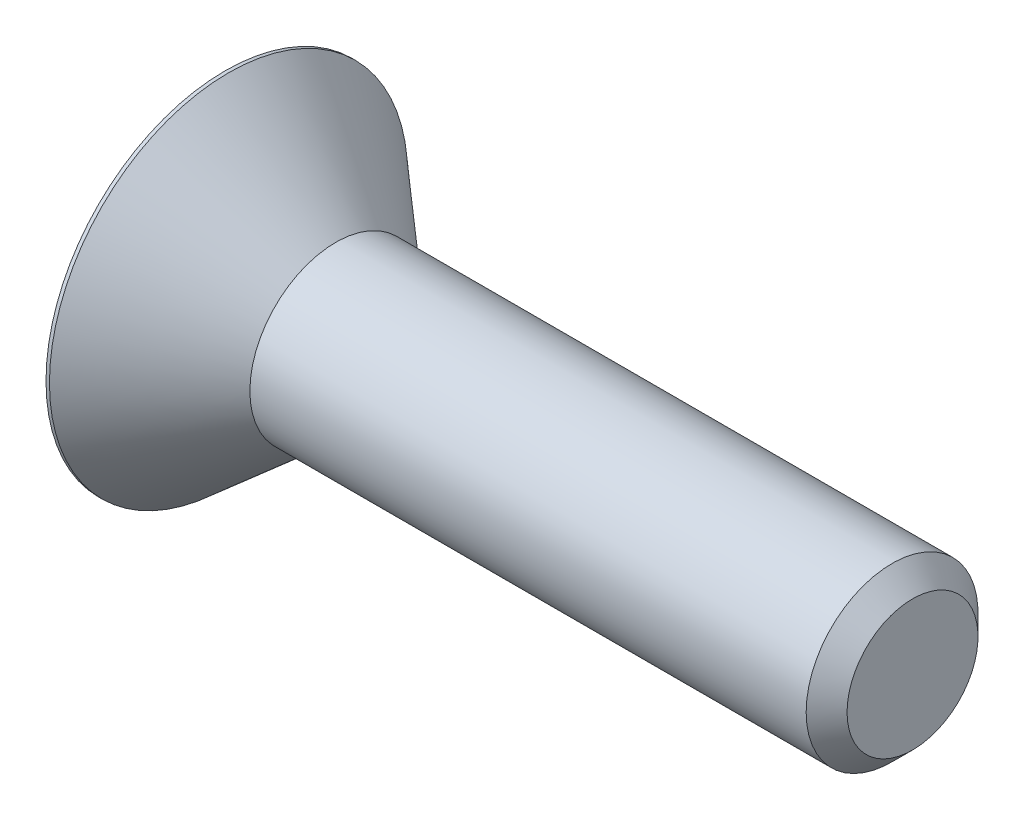
ISO-10303-21;
HEADER;
FILE_DESCRIPTION(('STEP AP214'),'2;1');
FILE_NAME('part.step','',(''),(''),'','','');
FILE_SCHEMA(('AUTOMOTIVE_DESIGN { 1 0 10303 214 1 1 1 1 }'));
ENDSEC;
DATA;
#1=APPLICATION_CONTEXT('core data for automotive mechanical design processes');
#2=APPLICATION_PROTOCOL_DEFINITION('international standard','automotive_design',2000,#1);
#3=PRODUCT_CONTEXT('',#1,'mechanical');
#4=PRODUCT('Part','Part','',(#3));
#5=PRODUCT_RELATED_PRODUCT_CATEGORY('part','',(#4));
#6=PRODUCT_DEFINITION_FORMATION('','',#4);
#7=PRODUCT_DEFINITION_CONTEXT('part definition',#1,'design');
#8=PRODUCT_DEFINITION('design','',#6,#7);
#9=PRODUCT_DEFINITION_SHAPE('','',#8);
#10=(LENGTH_UNIT() NAMED_UNIT(*) SI_UNIT(.MILLI.,.METRE.));
#11=(NAMED_UNIT(*) PLANE_ANGLE_UNIT() SI_UNIT($,.RADIAN.));
#12=(NAMED_UNIT(*) SI_UNIT($,.STERADIAN.) SOLID_ANGLE_UNIT());
#13=UNCERTAINTY_MEASURE_WITH_UNIT(LENGTH_MEASURE(1.E-05),#10,'distance_accuracy_value','');
#14=(GEOMETRIC_REPRESENTATION_CONTEXT(3) GLOBAL_UNCERTAINTY_ASSIGNED_CONTEXT((#13)) GLOBAL_UNIT_ASSIGNED_CONTEXT((#10,
#11,#12)) REPRESENTATION_CONTEXT('',''));
#15=CARTESIAN_POINT('',(0.,0.,0.));
#16=DIRECTION('',(0.,0.,1.));
#17=DIRECTION('',(1.,0.,0.));
#18=AXIS2_PLACEMENT_3D('',#15,#16,#17);
#19=CARTESIAN_POINT('',(0.,0.,0.));
#20=DIRECTION('',(-1.,0.,0.));
#21=DIRECTION('',(0.,0.,1.));
#22=AXIS2_PLACEMENT_3D('',#19,#20,#21);
#23=PLANE('',#22);
#24=CARTESIAN_POINT('',(0.,0.,0.));
#25=DIRECTION('',(-1.,0.,0.));
#26=DIRECTION('',(0.,0.,1.));
#27=AXIS2_PLACEMENT_3D('',#24,#25,#26);
#28=CIRCLE('',#27,6.61924);
#29=CARTESIAN_POINT('',(0.,0.,6.61924));
#30=VERTEX_POINT('',#29);
#31=EDGE_CURVE('E11',#30,#30,#28,.T.);
#32=ORIENTED_EDGE('',*,*,#31,.T.);
#33=EDGE_LOOP('',(#32));
#34=FACE_BOUND('',#33,.T.);
#35=DIRECTION('',(0.,-0.499999999999999,-0.866025403784439));
#36=VECTOR('',#35,1.);
#37=CARTESIAN_POINT('',(0.,-1.14384635331843,1.98120000000035));
#38=LINE('',#37,#36);
#39=CARTESIAN_POINT('',(0.,-1.14384635331843,1.98120000000035));
#40=VERTEX_POINT('',#39);
#41=CARTESIAN_POINT('',(0.,-2.28769270663687,0.));
#42=VERTEX_POINT('',#41);
#43=EDGE_CURVE('E124',#40,#42,#38,.T.);
#44=ORIENTED_EDGE('',*,*,#43,.T.);
#45=DIRECTION('',(0.,0.5,-0.866025403784439));
#46=VECTOR('',#45,1.);
#47=CARTESIAN_POINT('',(0.,-2.28769270663687,0.));
#48=LINE('',#47,#46);
#49=CARTESIAN_POINT('',(0.,-1.14384635331843,-1.98119999999991));
#50=VERTEX_POINT('',#49);
#51=EDGE_CURVE('E54',#42,#50,#48,.T.);
#52=ORIENTED_EDGE('',*,*,#51,.T.);
#53=DIRECTION('',(0.,1.,0.));
#54=VECTOR('',#53,1.);
#55=CARTESIAN_POINT('',(0.,-1.14384635331843,-1.98119999999991));
#56=LINE('',#55,#54);
#57=CARTESIAN_POINT('',(0.,1.14384635331843,-1.98119999999946));
#58=VERTEX_POINT('',#57);
#59=EDGE_CURVE('E139',#50,#58,#56,.T.);
#60=ORIENTED_EDGE('',*,*,#59,.T.);
#61=DIRECTION('',(0.,0.499999999999999,0.866025403784439));
#62=VECTOR('',#61,1.);
#63=CARTESIAN_POINT('',(0.,1.14384635331843,-1.98119999999946));
#64=LINE('',#63,#62);
#65=CARTESIAN_POINT('',(-1.38777878078145E-13,2.28769270663687,0.));
#66=VERTEX_POINT('',#65);
#67=EDGE_CURVE('E209',#58,#66,#64,.T.);
#68=ORIENTED_EDGE('',*,*,#67,.T.);
#69=DIRECTION('',(0.,-0.5,0.866025403784439));
#70=VECTOR('',#69,1.);
#71=CARTESIAN_POINT('',(-1.38777878078145E-13,2.28769270663687,0.));
#72=LINE('',#71,#70);
#73=CARTESIAN_POINT('',(0.,1.14384635331843,1.98120000000035));
#74=VERTEX_POINT('',#73);
#75=EDGE_CURVE('E193',#66,#74,#72,.T.);
#76=ORIENTED_EDGE('',*,*,#75,.T.);
#77=DIRECTION('',(0.,-1.,0.));
#78=VECTOR('',#77,1.);
#79=CARTESIAN_POINT('',(0.,1.14384635331843,1.98120000000035));
#80=LINE('',#79,#78);
#81=EDGE_CURVE('E188',#74,#40,#80,.T.);
#82=ORIENTED_EDGE('',*,*,#81,.T.);
#83=EDGE_LOOP('',(#44,#52,#60,#68,#76,#82));
#84=FACE_BOUND('',#83,.T.);
#85=ADVANCED_FACE('F40',(#34,#84),#23,.T.);
#86=CARTESIAN_POINT('',(0.,0.,0.));
#87=DIRECTION('',(-1.,0.,0.));
#88=DIRECTION('',(0.,0.,1.));
#89=AXIS2_PLACEMENT_3D('',#86,#87,#88);
#90=CYLINDRICAL_SURFACE('',#89,6.61924);
#91=CARTESIAN_POINT('',(0.126999999999999,0.,0.));
#92=DIRECTION('',(-1.,0.,0.));
#93=DIRECTION('',(0.,0.,1.));
#94=AXIS2_PLACEMENT_3D('',#91,#92,#93);
#95=CIRCLE('',#94,6.61924);
#96=CARTESIAN_POINT('',(0.126999999999999,0.,6.61924));
#97=VERTEX_POINT('',#96);
#98=EDGE_CURVE('E47',#97,#97,#95,.T.);
#99=ORIENTED_EDGE('',*,*,#98,.T.);
#100=EDGE_LOOP('',(#99));
#101=FACE_BOUND('',#100,.T.);
#102=ORIENTED_EDGE('',*,*,#31,.F.);
#103=EDGE_LOOP('',(#102));
#104=FACE_BOUND('',#103,.T.);
#105=ADVANCED_FACE('F164',(#101,#104),#90,.T.);
#106=CARTESIAN_POINT('',(0.126999999999999,0.,0.));
#107=DIRECTION('',(-1.,0.,0.));
#108=DIRECTION('',(0.,0.,1.));
#109=AXIS2_PLACEMENT_3D('',#106,#107,#108);
#110=CONICAL_SURFACE('',#109,6.61924,0.715584993317678);
#111=CARTESIAN_POINT('',(4.08914488288686,0.,0.));
#112=DIRECTION('',(-1.,0.,0.));
#113=DIRECTION('',(0.,0.,1.));
#114=AXIS2_PLACEMENT_3D('',#111,#112,#113);
#115=CIRCLE('',#114,3.175);
#116=CARTESIAN_POINT('',(4.08914488288686,0.,3.175));
#117=VERTEX_POINT('',#116);
#118=EDGE_CURVE('E159',#117,#117,#115,.T.);
#119=ORIENTED_EDGE('',*,*,#118,.T.);
#120=EDGE_LOOP('',(#119));
#121=FACE_BOUND('',#120,.T.);
#122=ORIENTED_EDGE('',*,*,#98,.F.);
#123=EDGE_LOOP('',(#122));
#124=FACE_BOUND('',#123,.T.);
#125=ADVANCED_FACE('F167',(#121,#124),#110,.T.);
#126=CARTESIAN_POINT('',(0.,0.,0.));
#127=DIRECTION('',(-1.,0.,0.));
#128=DIRECTION('',(0.,0.,1.));
#129=AXIS2_PLACEMENT_3D('',#126,#127,#128);
#130=CYLINDRICAL_SURFACE('',#129,3.175);
#131=CARTESIAN_POINT('',(24.64435,-8.88178419700125E-12,0.));
#132=DIRECTION('',(-1.,0.,0.));
#133=DIRECTION('',(0.,0.,1.));
#134=AXIS2_PLACEMENT_3D('',#131,#132,#133);
#135=CIRCLE('',#134,3.175);
#136=CARTESIAN_POINT('',(24.64435,-8.88178419700125E-12,3.175));
#137=VERTEX_POINT('',#136);
#138=EDGE_CURVE('E156',#137,#137,#135,.T.);
#139=ORIENTED_EDGE('',*,*,#138,.T.);
#140=EDGE_LOOP('',(#139));
#141=FACE_BOUND('',#140,.T.);
#142=ORIENTED_EDGE('',*,*,#118,.F.);
#143=EDGE_LOOP('',(#142));
#144=FACE_BOUND('',#143,.T.);
#145=ADVANCED_FACE('F169',(#141,#144),#130,.T.);
#146=CARTESIAN_POINT('',(25.4,-8.88178419700125E-12,0.));
#147=DIRECTION('',(-1.,0.,0.));
#148=DIRECTION('',(0.,0.,1.));
#149=AXIS2_PLACEMENT_3D('',#146,#147,#148);
#150=CONICAL_SURFACE('',#149,2.41935,0.785398163397442);
#151=ORIENTED_EDGE('',*,*,#138,.F.);
#152=EDGE_LOOP('',(#151));
#153=FACE_BOUND('',#152,.T.);
#154=CARTESIAN_POINT('',(25.4,-8.88178419700125E-12,0.));
#155=DIRECTION('',(-1.,0.,0.));
#156=DIRECTION('',(0.,0.,1.));
#157=AXIS2_PLACEMENT_3D('',#154,#155,#156);
#158=CIRCLE('',#157,2.41935);
#159=CARTESIAN_POINT('',(25.4,-8.88178419700125E-12,2.41935));
#160=VERTEX_POINT('',#159);
#161=EDGE_CURVE('E152',#160,#160,#158,.T.);
#162=ORIENTED_EDGE('',*,*,#161,.T.);
#163=EDGE_LOOP('',(#162));
#164=FACE_BOUND('',#163,.T.);
#165=ADVANCED_FACE('F176',(#153,#164),#150,.T.);
#166=CARTESIAN_POINT('',(25.3999999999999,2.41934999999116,0.));
#167=DIRECTION('',(1.,0.,0.));
#168=DIRECTION('',(0.,0.,-1.));
#169=AXIS2_PLACEMENT_3D('',#166,#167,#168);
#170=PLANE('',#169);
#171=ORIENTED_EDGE('',*,*,#161,.F.);
#172=EDGE_LOOP('',(#171));
#173=FACE_BOUND('',#172,.T.);
#174=ADVANCED_FACE('F264',(#173),#170,.T.);
#175=CARTESIAN_POINT('',(2.8194,-2.28769270663687,0.));
#176=DIRECTION('',(0.,0.866025403784439,0.5));
#177=DIRECTION('',(0.,-0.5,0.866025403784439));
#178=AXIS2_PLACEMENT_3D('',#175,#176,#177);
#179=PLANE('',#178);
#180=ORIENTED_EDGE('',*,*,#51,.F.);
#181=DIRECTION('',(-1.,0.,0.));
#182=VECTOR('',#181,1.);
#183=CARTESIAN_POINT('',(2.8194,-2.28769270663687,0.));
#184=LINE('',#183,#182);
#185=CARTESIAN_POINT('',(2.8194,-2.28769270663687,0.));
#186=VERTEX_POINT('',#185);
#187=EDGE_CURVE('E197',#186,#42,#184,.T.);
#188=ORIENTED_EDGE('',*,*,#187,.F.);
#189=DIRECTION('',(0.,0.5,-0.866025403784439));
#190=VECTOR('',#189,1.);
#191=CARTESIAN_POINT('',(2.8194,-2.28769270663687,0.));
#192=LINE('',#191,#190);
#193=CARTESIAN_POINT('',(2.81940000000005,-1.71576952997765,-0.990599999999731));
#194=VERTEX_POINT('',#193);
#195=EDGE_CURVE('E121',#186,#194,#192,.T.);
#196=ORIENTED_EDGE('',*,*,#195,.T.);
#197=CARTESIAN_POINT('',(2.81939999999997,-1.14384635331843,-1.98119999999946));
#198=VERTEX_POINT('',#197);
#199=EDGE_CURVE('E115',#194,#198,#192,.T.);
#200=ORIENTED_EDGE('',*,*,#199,.T.);
#201=DIRECTION('',(-1.,0.,0.));
#202=VECTOR('',#201,1.);
#203=CARTESIAN_POINT('',(2.81939999999997,-1.14384635331843,-1.98119999999946));
#204=LINE('',#203,#202);
#205=EDGE_CURVE('E119',#198,#50,#204,.T.);
#206=ORIENTED_EDGE('',*,*,#205,.T.);
#207=EDGE_LOOP('',(#180,#188,#196,#200,#206));
#208=FACE_BOUND('',#207,.T.);
#209=ADVANCED_FACE('F117',(#208),#179,.T.);
#210=CARTESIAN_POINT('',(2.81939999999997,-1.14384635331843,-1.98119999999946));
#211=DIRECTION('',(0.,0.,1.));
#212=DIRECTION('',(0.,-1.,0.));
#213=AXIS2_PLACEMENT_3D('',#210,#211,#212);
#214=PLANE('',#213);
#215=ORIENTED_EDGE('',*,*,#59,.F.);
#216=ORIENTED_EDGE('',*,*,#205,.F.);
#217=DIRECTION('',(0.,1.,0.));
#218=VECTOR('',#217,1.);
#219=CARTESIAN_POINT('',(2.81939999999997,-1.14384635331843,-1.98119999999946));
#220=LINE('',#219,#218);
#221=CARTESIAN_POINT('',(2.81939999999997,0.,-1.98119999999946));
#222=VERTEX_POINT('',#221);
#223=EDGE_CURVE('E127',#198,#222,#220,.T.);
#224=ORIENTED_EDGE('',*,*,#223,.T.);
#225=CARTESIAN_POINT('',(2.81939999999997,1.14384635331843,-1.98119999999946));
#226=VERTEX_POINT('',#225);
#227=EDGE_CURVE('E134',#222,#226,#220,.T.);
#228=ORIENTED_EDGE('',*,*,#227,.T.);
#229=DIRECTION('',(-1.,0.,0.));
#230=VECTOR('',#229,1.);
#231=CARTESIAN_POINT('',(2.81939999999997,1.14384635331843,-1.98119999999946));
#232=LINE('',#231,#230);
#233=EDGE_CURVE('E141',#226,#58,#232,.T.);
#234=ORIENTED_EDGE('',*,*,#233,.T.);
#235=EDGE_LOOP('',(#215,#216,#224,#228,#234));
#236=FACE_BOUND('',#235,.T.);
#237=ADVANCED_FACE('F136',(#236),#214,.T.);
#238=CARTESIAN_POINT('',(2.81939999999997,1.14384635331843,-1.98119999999946));
#239=DIRECTION('',(0.,-0.866025403784439,0.499999999999999));
#240=DIRECTION('',(0.,-0.499999999999999,-0.866025403784439));
#241=AXIS2_PLACEMENT_3D('',#238,#239,#240);
#242=PLANE('',#241);
#243=ORIENTED_EDGE('',*,*,#67,.F.);
#244=ORIENTED_EDGE('',*,*,#233,.F.);
#245=DIRECTION('',(0.,0.499999999999999,0.866025403784439));
#246=VECTOR('',#245,1.);
#247=CARTESIAN_POINT('',(2.81939999999997,1.14384635331843,-1.98119999999946));
#248=LINE('',#247,#246);
#249=CARTESIAN_POINT('',(2.81940000000005,1.71576952997765,-0.990599999999731));
#250=VERTEX_POINT('',#249);
#251=EDGE_CURVE('E225',#226,#250,#248,.T.);
#252=ORIENTED_EDGE('',*,*,#251,.T.);
#253=CARTESIAN_POINT('',(2.81939999999986,2.28769270663709,0.));
#254=VERTEX_POINT('',#253);
#255=EDGE_CURVE('E133',#250,#254,#248,.T.);
#256=ORIENTED_EDGE('',*,*,#255,.T.);
#257=DIRECTION('',(-1.,0.,0.));
#258=VECTOR('',#257,1.);
#259=CARTESIAN_POINT('',(2.81939999999986,2.28769270663709,0.));
#260=LINE('',#259,#258);
#261=EDGE_CURVE('E147',#254,#66,#260,.T.);
#262=ORIENTED_EDGE('',*,*,#261,.T.);
#263=EDGE_LOOP('',(#243,#244,#252,#256,#262));
#264=FACE_BOUND('',#263,.T.);
#265=ADVANCED_FACE('F207',(#264),#242,.T.);
#266=CARTESIAN_POINT('',(2.81939999999986,2.28769270663709,0.));
#267=DIRECTION('',(0.,-0.866025403784439,-0.5));
#268=DIRECTION('',(0.,0.5,-0.866025403784439));
#269=AXIS2_PLACEMENT_3D('',#266,#267,#268);
#270=PLANE('',#269);
#271=ORIENTED_EDGE('',*,*,#75,.F.);
#272=ORIENTED_EDGE('',*,*,#261,.F.);
#273=DIRECTION('',(0.,-0.5,0.866025403784439));
#274=VECTOR('',#273,1.);
#275=CARTESIAN_POINT('',(2.81939999999986,2.28769270663709,0.));
#276=LINE('',#275,#274);
#277=CARTESIAN_POINT('',(2.81939999999997,1.71576952997765,0.990600000000619));
#278=VERTEX_POINT('',#277);
#279=EDGE_CURVE('E62',#254,#278,#276,.T.);
#280=ORIENTED_EDGE('',*,*,#279,.T.);
#281=CARTESIAN_POINT('',(2.81939999999992,1.14384635331843,1.98120000000035));
#282=VERTEX_POINT('',#281);
#283=EDGE_CURVE('E224',#278,#282,#276,.T.);
#284=ORIENTED_EDGE('',*,*,#283,.T.);
#285=DIRECTION('',(-1.,0.,0.));
#286=VECTOR('',#285,1.);
#287=CARTESIAN_POINT('',(2.81939999999992,1.14384635331843,1.98120000000035));
#288=LINE('',#287,#286);
#289=EDGE_CURVE('E202',#282,#74,#288,.T.);
#290=ORIENTED_EDGE('',*,*,#289,.T.);
#291=EDGE_LOOP('',(#271,#272,#280,#284,#290));
#292=FACE_BOUND('',#291,.T.);
#293=ADVANCED_FACE('F248',(#292),#270,.T.);
#294=CARTESIAN_POINT('',(2.81939999999992,1.14384635331843,1.98120000000035));
#295=DIRECTION('',(0.,0.,-1.));
#296=DIRECTION('',(0.,1.,0.));
#297=AXIS2_PLACEMENT_3D('',#294,#295,#296);
#298=PLANE('',#297);
#299=ORIENTED_EDGE('',*,*,#81,.F.);
#300=ORIENTED_EDGE('',*,*,#289,.F.);
#301=DIRECTION('',(0.,-1.,0.));
#302=VECTOR('',#301,1.);
#303=CARTESIAN_POINT('',(2.81939999999992,1.14384635331843,1.98120000000035));
#304=LINE('',#303,#302);
#305=CARTESIAN_POINT('',(2.81940000000005,0.,1.98120000000035));
#306=VERTEX_POINT('',#305);
#307=EDGE_CURVE('E219',#282,#306,#304,.T.);
#308=ORIENTED_EDGE('',*,*,#307,.T.);
#309=CARTESIAN_POINT('',(2.81939999999992,-1.14384635331843,1.98120000000035));
#310=VERTEX_POINT('',#309);
#311=EDGE_CURVE('E222',#306,#310,#304,.T.);
#312=ORIENTED_EDGE('',*,*,#311,.T.);
#313=DIRECTION('',(-1.,0.,0.));
#314=VECTOR('',#313,1.);
#315=CARTESIAN_POINT('',(2.81939999999992,-1.14384635331843,1.98120000000035));
#316=LINE('',#315,#314);
#317=EDGE_CURVE('E199',#310,#40,#316,.T.);
#318=ORIENTED_EDGE('',*,*,#317,.T.);
#319=EDGE_LOOP('',(#299,#300,#308,#312,#318));
#320=FACE_BOUND('',#319,.T.);
#321=ADVANCED_FACE('F247',(#320),#298,.T.);
#322=CARTESIAN_POINT('',(2.81939999999992,-1.14384635331843,1.98120000000035));
#323=DIRECTION('',(0.,0.866025403784439,-0.499999999999999));
#324=DIRECTION('',(0.,0.499999999999999,0.866025403784439));
#325=AXIS2_PLACEMENT_3D('',#322,#323,#324);
#326=PLANE('',#325);
#327=ORIENTED_EDGE('',*,*,#43,.F.);
#328=ORIENTED_EDGE('',*,*,#317,.F.);
#329=DIRECTION('',(0.,-0.499999999999999,-0.866025403784439));
#330=VECTOR('',#329,1.);
#331=CARTESIAN_POINT('',(2.81939999999992,-1.14384635331843,1.98120000000035));
#332=LINE('',#331,#330);
#333=CARTESIAN_POINT('',(2.81939999999997,-1.71576952997765,0.990600000000619));
#334=VERTEX_POINT('',#333);
#335=EDGE_CURVE('E200',#310,#334,#332,.T.);
#336=ORIENTED_EDGE('',*,*,#335,.T.);
#337=EDGE_CURVE('E218',#334,#186,#332,.T.);
#338=ORIENTED_EDGE('',*,*,#337,.T.);
#339=ORIENTED_EDGE('',*,*,#187,.T.);
#340=EDGE_LOOP('',(#327,#328,#336,#338,#339));
#341=FACE_BOUND('',#340,.T.);
#342=ADVANCED_FACE('F255',(#341),#326,.T.);
#343=CARTESIAN_POINT('',(2.81939999999992,-3.43153905995552,1.98120000000035));
#344=DIRECTION('',(-1.,0.,0.));
#345=DIRECTION('',(0.,0.,1.));
#346=AXIS2_PLACEMENT_3D('',#343,#344,#345);
#347=PLANE('',#346);
#348=CARTESIAN_POINT('',(2.8194,0.,0.));
#349=DIRECTION('',(-1.,0.,0.));
#350=DIRECTION('',(0.,0.,1.));
#351=AXIS2_PLACEMENT_3D('',#348,#349,#350);
#352=CIRCLE('',#351,1.9812);
#353=EDGE_CURVE('E140',#334,#306,#352,.T.);
#354=ORIENTED_EDGE('',*,*,#353,.F.);
#355=ORIENTED_EDGE('',*,*,#335,.F.);
#356=ORIENTED_EDGE('',*,*,#311,.F.);
#357=EDGE_LOOP('',(#354,#355,#356));
#358=FACE_BOUND('',#357,.T.);
#359=ADVANCED_FACE('F243',(#358),#347,.T.);
#360=EDGE_CURVE('E144',#194,#334,#352,.T.);
#361=ORIENTED_EDGE('',*,*,#360,.F.);
#362=ORIENTED_EDGE('',*,*,#195,.F.);
#363=ORIENTED_EDGE('',*,*,#337,.F.);
#364=EDGE_LOOP('',(#361,#362,#363));
#365=FACE_BOUND('',#364,.T.);
#366=ADVANCED_FACE('F325',(#365),#347,.T.);
#367=EDGE_CURVE('E129',#222,#194,#352,.T.);
#368=ORIENTED_EDGE('',*,*,#367,.F.);
#369=ORIENTED_EDGE('',*,*,#223,.F.);
#370=ORIENTED_EDGE('',*,*,#199,.F.);
#371=EDGE_LOOP('',(#368,#369,#370));
#372=FACE_BOUND('',#371,.T.);
#373=ADVANCED_FACE('F128',(#372),#347,.T.);
#374=EDGE_CURVE('E230',#250,#222,#352,.T.);
#375=ORIENTED_EDGE('',*,*,#374,.F.);
#376=ORIENTED_EDGE('',*,*,#251,.F.);
#377=ORIENTED_EDGE('',*,*,#227,.F.);
#378=EDGE_LOOP('',(#375,#376,#377));
#379=FACE_BOUND('',#378,.T.);
#380=ADVANCED_FACE('F229',(#379),#347,.T.);
#381=EDGE_CURVE('E153',#278,#250,#352,.T.);
#382=ORIENTED_EDGE('',*,*,#381,.F.);
#383=ORIENTED_EDGE('',*,*,#279,.F.);
#384=ORIENTED_EDGE('',*,*,#255,.F.);
#385=EDGE_LOOP('',(#382,#383,#384));
#386=FACE_BOUND('',#385,.T.);
#387=ADVANCED_FACE('F234',(#386),#347,.T.);
#388=EDGE_CURVE('E146',#306,#278,#352,.T.);
#389=ORIENTED_EDGE('',*,*,#388,.F.);
#390=ORIENTED_EDGE('',*,*,#307,.F.);
#391=ORIENTED_EDGE('',*,*,#283,.F.);
#392=EDGE_LOOP('',(#389,#390,#391));
#393=FACE_BOUND('',#392,.T.);
#394=ADVANCED_FACE('F240',(#393),#347,.T.);
#395=CARTESIAN_POINT('',(2.8194,0.,0.));
#396=DIRECTION('',(-1.,0.,0.));
#397=DIRECTION('',(0.,0.,1.));
#398=AXIS2_PLACEMENT_3D('',#395,#396,#397);
#399=CONICAL_SURFACE('',#398,1.9812,1.04719755119659);
#400=CARTESIAN_POINT('',(3.9632463533185,0.,0.));
#401=VERTEX_POINT('',#400);
#402=VERTEX_LOOP('',#401);
#403=FACE_BOUND('',#402,.T.);
#404=ORIENTED_EDGE('',*,*,#388,.T.);
#405=ORIENTED_EDGE('',*,*,#381,.T.);
#406=ORIENTED_EDGE('',*,*,#374,.T.);
#407=ORIENTED_EDGE('',*,*,#367,.T.);
#408=ORIENTED_EDGE('',*,*,#360,.T.);
#409=ORIENTED_EDGE('',*,*,#353,.T.);
#410=EDGE_LOOP('',(#404,#405,#406,#407,#408,#409));
#411=FACE_BOUND('',#410,.T.);
#412=ADVANCED_FACE('F235',(#403,#411),#399,.F.);
#413=CLOSED_SHELL('',(#85,#105,#125,#145,#165,#174,#209,#237,#265,#293,#321,#342,#359,#366,#373,
#380,#387,#394,#412));
#414=MANIFOLD_SOLID_BREP('B2',#413);
#415=ADVANCED_BREP_SHAPE_REPRESENTATION('',(#18,#414),#14);
#416=SHAPE_DEFINITION_REPRESENTATION(#9,#415);
ENDSEC;
END-ISO-10303-21;
